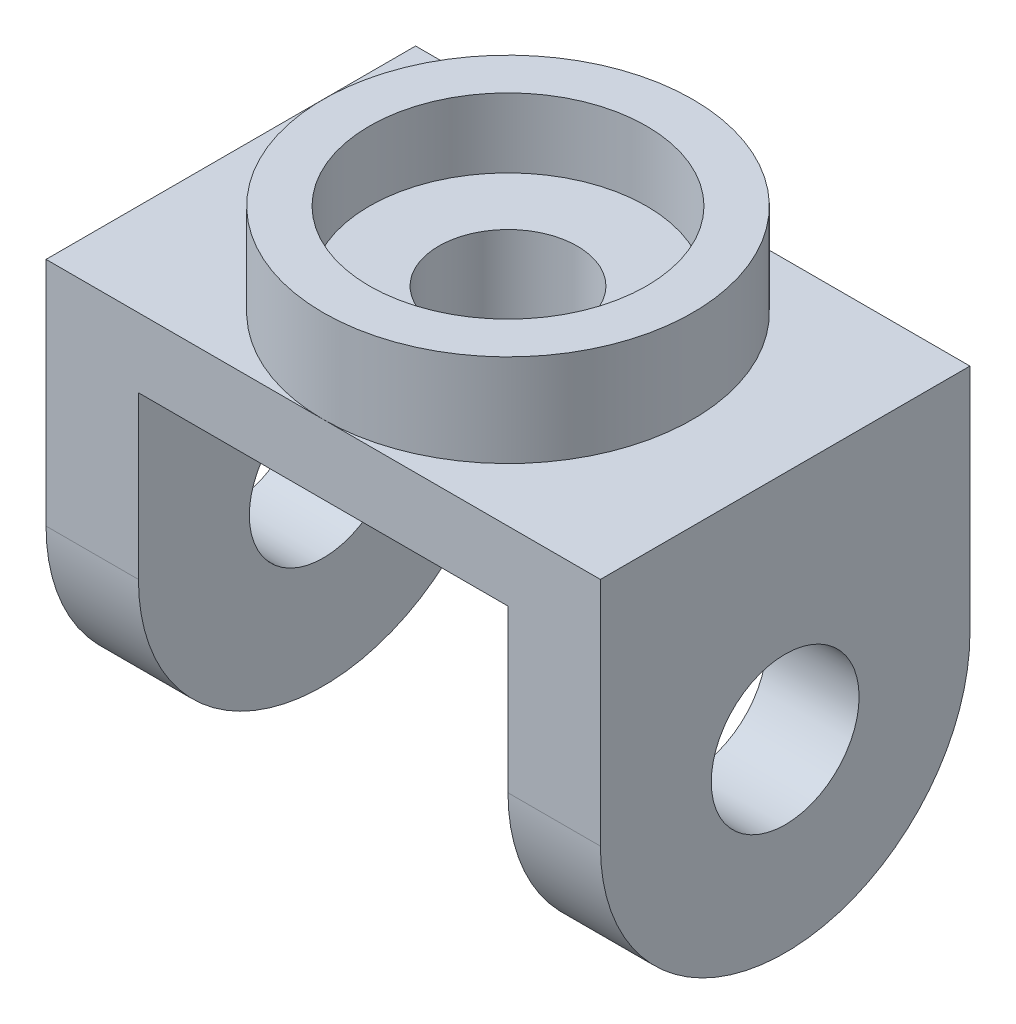
ISO-10303-21;
HEADER;
FILE_DESCRIPTION(('STEP AP214'),'2;1');
FILE_NAME('part.step','',(''),(''),'','','');
FILE_SCHEMA(('AUTOMOTIVE_DESIGN { 1 0 10303 214 1 1 1 1 }'));
ENDSEC;
DATA;
#1=APPLICATION_CONTEXT('core data for automotive mechanical design processes');
#2=APPLICATION_PROTOCOL_DEFINITION('international standard','automotive_design',2000,#1);
#3=PRODUCT_CONTEXT('',#1,'mechanical');
#4=PRODUCT('Part','Part','',(#3));
#5=PRODUCT_RELATED_PRODUCT_CATEGORY('part','',(#4));
#6=PRODUCT_DEFINITION_FORMATION('','',#4);
#7=PRODUCT_DEFINITION_CONTEXT('part definition',#1,'design');
#8=PRODUCT_DEFINITION('design','',#6,#7);
#9=PRODUCT_DEFINITION_SHAPE('','',#8);
#10=(LENGTH_UNIT() NAMED_UNIT(*) SI_UNIT(.MILLI.,.METRE.));
#11=(NAMED_UNIT(*) PLANE_ANGLE_UNIT() SI_UNIT($,.RADIAN.));
#12=(NAMED_UNIT(*) SI_UNIT($,.STERADIAN.) SOLID_ANGLE_UNIT());
#13=UNCERTAINTY_MEASURE_WITH_UNIT(LENGTH_MEASURE(1.E-05),#10,'distance_accuracy_value','');
#14=(GEOMETRIC_REPRESENTATION_CONTEXT(3) GLOBAL_UNCERTAINTY_ASSIGNED_CONTEXT((#13)) GLOBAL_UNIT_ASSIGNED_CONTEXT((#10,
#11,#12)) REPRESENTATION_CONTEXT('',''));
#15=CARTESIAN_POINT('',(0.,0.,0.));
#16=DIRECTION('',(0.,0.,1.));
#17=DIRECTION('',(1.,0.,0.));
#18=AXIS2_PLACEMENT_3D('',#15,#16,#17);
#19=CARTESIAN_POINT('',(0.,0.,0.));
#20=DIRECTION('',(0.,1.,0.));
#21=DIRECTION('',(0.,0.,1.));
#22=AXIS2_PLACEMENT_3D('',#19,#20,#21);
#23=PLANE('',#22);
#24=CARTESIAN_POINT('',(0.,0.,0.));
#25=DIRECTION('',(0.,1.,0.));
#26=DIRECTION('',(0.,0.,1.));
#27=AXIS2_PLACEMENT_3D('',#24,#25,#26);
#28=CIRCLE('',#27,15.);
#29=CARTESIAN_POINT('',(0.,0.,15.));
#30=VERTEX_POINT('',#29);
#31=EDGE_CURVE('E250',#30,#30,#28,.F.);
#32=ORIENTED_EDGE('',*,*,#31,.F.);
#33=EDGE_LOOP('',(#32));
#34=FACE_BOUND('',#33,.T.);
#35=DIRECTION('',(0.,0.,-1.));
#36=VECTOR('',#35,1.);
#37=CARTESIAN_POINT('',(40.,0.,0.));
#38=LINE('',#37,#36);
#39=CARTESIAN_POINT('',(40.,0.,40.));
#40=VERTEX_POINT('',#39);
#41=CARTESIAN_POINT('',(40.,0.,-40.));
#42=VERTEX_POINT('',#41);
#43=EDGE_CURVE('E111',#40,#42,#38,.T.);
#44=ORIENTED_EDGE('',*,*,#43,.F.);
#45=DIRECTION('',(1.,0.,0.));
#46=VECTOR('',#45,1.);
#47=CARTESIAN_POINT('',(-60.,0.,40.));
#48=LINE('',#47,#46);
#49=CARTESIAN_POINT('',(-40.,0.,40.));
#50=VERTEX_POINT('',#49);
#51=EDGE_CURVE('E174',#50,#40,#48,.T.);
#52=ORIENTED_EDGE('',*,*,#51,.F.);
#53=DIRECTION('',(0.,0.,1.));
#54=VECTOR('',#53,1.);
#55=CARTESIAN_POINT('',(-40.,0.,0.));
#56=LINE('',#55,#54);
#57=CARTESIAN_POINT('',(-40.,0.,-40.));
#58=VERTEX_POINT('',#57);
#59=EDGE_CURVE('E11',#58,#50,#56,.T.);
#60=ORIENTED_EDGE('',*,*,#59,.F.);
#61=DIRECTION('',(-1.,0.,0.));
#62=VECTOR('',#61,1.);
#63=CARTESIAN_POINT('',(-60.,0.,-40.));
#64=LINE('',#63,#62);
#65=EDGE_CURVE('E168',#42,#58,#64,.T.);
#66=ORIENTED_EDGE('',*,*,#65,.F.);
#67=EDGE_LOOP('',(#44,#52,#60,#66));
#68=FACE_BOUND('',#67,.T.);
#69=ADVANCED_FACE('F33',(#34,#68),#23,.F.);
#70=CARTESIAN_POINT('',(0.,15.,0.));
#71=DIRECTION('',(0.,1.,0.));
#72=DIRECTION('',(0.,0.,1.));
#73=AXIS2_PLACEMENT_3D('',#70,#71,#72);
#74=PLANE('',#73);
#75=DIRECTION('',(-1.,0.,0.));
#76=VECTOR('',#75,1.);
#77=CARTESIAN_POINT('',(-60.,15.,-40.));
#78=LINE('',#77,#76);
#79=CARTESIAN_POINT('',(60.,15.,-40.));
#80=VERTEX_POINT('',#79);
#81=CARTESIAN_POINT('',(0.,15.,-40.));
#82=VERTEX_POINT('',#81);
#83=EDGE_CURVE('E175',#80,#82,#78,.T.);
#84=ORIENTED_EDGE('',*,*,#83,.T.);
#85=CARTESIAN_POINT('',(0.,15.,0.));
#86=DIRECTION('',(0.,1.,0.));
#87=DIRECTION('',(0.,0.,1.));
#88=AXIS2_PLACEMENT_3D('',#85,#86,#87);
#89=CIRCLE('',#88,40.);
#90=CARTESIAN_POINT('',(0.,15.,40.));
#91=VERTEX_POINT('',#90);
#92=EDGE_CURVE('E47',#91,#82,#89,.T.);
#93=ORIENTED_EDGE('',*,*,#92,.F.);
#94=DIRECTION('',(1.,0.,0.));
#95=VECTOR('',#94,1.);
#96=CARTESIAN_POINT('',(-60.,15.,40.));
#97=LINE('',#96,#95);
#98=CARTESIAN_POINT('',(60.,15.,40.));
#99=VERTEX_POINT('',#98);
#100=EDGE_CURVE('E54',#91,#99,#97,.T.);
#101=ORIENTED_EDGE('',*,*,#100,.T.);
#102=DIRECTION('',(0.,0.,-1.));
#103=VECTOR('',#102,1.);
#104=CARTESIAN_POINT('',(60.,15.,-40.));
#105=LINE('',#104,#103);
#106=EDGE_CURVE('E171',#99,#80,#105,.T.);
#107=ORIENTED_EDGE('',*,*,#106,.T.);
#108=EDGE_LOOP('',(#84,#93,#101,#107));
#109=FACE_BOUND('',#108,.T.);
#110=ADVANCED_FACE('F205',(#109),#74,.T.);
#111=CARTESIAN_POINT('',(60.,15.,-40.));
#112=DIRECTION('',(-1.,0.,0.));
#113=DIRECTION('',(0.,0.,1.));
#114=AXIS2_PLACEMENT_3D('',#111,#112,#113);
#115=PLANE('',#114);
#116=CARTESIAN_POINT('',(60.,-35.,0.));
#117=DIRECTION('',(-1.,0.,0.));
#118=DIRECTION('',(0.,0.,1.));
#119=AXIS2_PLACEMENT_3D('',#116,#117,#118);
#120=CIRCLE('',#119,16.);
#121=CARTESIAN_POINT('',(60.,-35.,16.));
#122=VERTEX_POINT('',#121);
#123=EDGE_CURVE('E134',#122,#122,#120,.T.);
#124=ORIENTED_EDGE('',*,*,#123,.T.);
#125=EDGE_LOOP('',(#124));
#126=FACE_BOUND('',#125,.T.);
#127=DIRECTION('',(0.,-1.,0.));
#128=VECTOR('',#127,1.);
#129=CARTESIAN_POINT('',(60.,15.,40.));
#130=LINE('',#129,#128);
#131=CARTESIAN_POINT('',(60.,-35.,40.));
#132=VERTEX_POINT('',#131);
#133=EDGE_CURVE('E182',#99,#132,#130,.T.);
#134=ORIENTED_EDGE('',*,*,#133,.T.);
#135=CARTESIAN_POINT('',(60.,-35.,0.));
#136=DIRECTION('',(-1.,0.,0.));
#137=DIRECTION('',(0.,0.,1.));
#138=AXIS2_PLACEMENT_3D('',#135,#136,#137);
#139=CIRCLE('',#138,40.);
#140=CARTESIAN_POINT('',(60.,-35.,-40.));
#141=VERTEX_POINT('',#140);
#142=EDGE_CURVE('E114',#141,#132,#139,.T.);
#143=ORIENTED_EDGE('',*,*,#142,.F.);
#144=DIRECTION('',(0.,-1.,0.));
#145=VECTOR('',#144,1.);
#146=CARTESIAN_POINT('',(60.,15.,-40.));
#147=LINE('',#146,#145);
#148=EDGE_CURVE('E120',#80,#141,#147,.T.);
#149=ORIENTED_EDGE('',*,*,#148,.F.);
#150=ORIENTED_EDGE('',*,*,#106,.F.);
#151=EDGE_LOOP('',(#134,#143,#149,#150));
#152=FACE_BOUND('',#151,.T.);
#153=ADVANCED_FACE('F35',(#126,#152),#115,.F.);
#154=CARTESIAN_POINT('',(-60.,15.,-40.));
#155=DIRECTION('',(0.,0.,1.));
#156=DIRECTION('',(1.,0.,0.));
#157=AXIS2_PLACEMENT_3D('',#154,#155,#156);
#158=PLANE('',#157);
#159=ORIENTED_EDGE('',*,*,#148,.T.);
#160=DIRECTION('',(1.,0.,0.));
#161=VECTOR('',#160,1.);
#162=CARTESIAN_POINT('',(40.,-35.,-40.));
#163=LINE('',#162,#161);
#164=CARTESIAN_POINT('',(40.,-35.,-40.));
#165=VERTEX_POINT('',#164);
#166=EDGE_CURVE('E117',#165,#141,#163,.T.);
#167=ORIENTED_EDGE('',*,*,#166,.F.);
#168=DIRECTION('',(0.,-1.,0.));
#169=VECTOR('',#168,1.);
#170=CARTESIAN_POINT('',(40.,15.,-40.));
#171=LINE('',#170,#169);
#172=EDGE_CURVE('E104',#42,#165,#171,.T.);
#173=ORIENTED_EDGE('',*,*,#172,.F.);
#174=ORIENTED_EDGE('',*,*,#65,.T.);
#175=DIRECTION('',(0.,-1.,0.));
#176=VECTOR('',#175,1.);
#177=CARTESIAN_POINT('',(-40.,15.,-40.));
#178=LINE('',#177,#176);
#179=CARTESIAN_POINT('',(-40.,-35.,-40.));
#180=VERTEX_POINT('',#179);
#181=EDGE_CURVE('E149',#58,#180,#178,.T.);
#182=ORIENTED_EDGE('',*,*,#181,.T.);
#183=DIRECTION('',(-1.,0.,0.));
#184=VECTOR('',#183,1.);
#185=CARTESIAN_POINT('',(-40.,-35.,-40.));
#186=LINE('',#185,#184);
#187=CARTESIAN_POINT('',(-60.,-35.,-40.));
#188=VERTEX_POINT('',#187);
#189=EDGE_CURVE('E151',#180,#188,#186,.T.);
#190=ORIENTED_EDGE('',*,*,#189,.T.);
#191=DIRECTION('',(0.,-1.,0.));
#192=VECTOR('',#191,1.);
#193=CARTESIAN_POINT('',(-60.,15.,-40.));
#194=LINE('',#193,#192);
#195=CARTESIAN_POINT('',(-60.,15.,-40.));
#196=VERTEX_POINT('',#195);
#197=EDGE_CURVE('E189',#196,#188,#194,.T.);
#198=ORIENTED_EDGE('',*,*,#197,.F.);
#199=EDGE_CURVE('E173',#82,#196,#78,.T.);
#200=ORIENTED_EDGE('',*,*,#199,.F.);
#201=ORIENTED_EDGE('',*,*,#83,.F.);
#202=EDGE_LOOP('',(#159,#167,#173,#174,#182,#190,#198,#200,#201));
#203=FACE_BOUND('',#202,.T.);
#204=ADVANCED_FACE('F118',(#203),#158,.F.);
#205=CARTESIAN_POINT('',(-60.,15.,-40.));
#206=DIRECTION('',(1.,0.,0.));
#207=DIRECTION('',(0.,0.,-1.));
#208=AXIS2_PLACEMENT_3D('',#205,#206,#207);
#209=PLANE('',#208);
#210=ORIENTED_EDGE('',*,*,#197,.T.);
#211=CARTESIAN_POINT('',(-60.,-35.,0.));
#212=DIRECTION('',(-1.,0.,0.));
#213=DIRECTION('',(0.,0.,1.));
#214=AXIS2_PLACEMENT_3D('',#211,#212,#213);
#215=CIRCLE('',#214,40.);
#216=CARTESIAN_POINT('',(-60.,-35.,40.));
#217=VERTEX_POINT('',#216);
#218=EDGE_CURVE('E143',#188,#217,#215,.T.);
#219=ORIENTED_EDGE('',*,*,#218,.T.);
#220=DIRECTION('',(0.,-1.,0.));
#221=VECTOR('',#220,1.);
#222=CARTESIAN_POINT('',(-60.,15.,40.));
#223=LINE('',#222,#221);
#224=CARTESIAN_POINT('',(-60.,15.,40.));
#225=VERTEX_POINT('',#224);
#226=EDGE_CURVE('E187',#225,#217,#223,.T.);
#227=ORIENTED_EDGE('',*,*,#226,.F.);
#228=DIRECTION('',(0.,0.,1.));
#229=VECTOR('',#228,1.);
#230=CARTESIAN_POINT('',(-60.,15.,-40.));
#231=LINE('',#230,#229);
#232=EDGE_CURVE('E177',#196,#225,#231,.T.);
#233=ORIENTED_EDGE('',*,*,#232,.F.);
#234=EDGE_LOOP('',(#210,#219,#227,#233));
#235=FACE_BOUND('',#234,.T.);
#236=CARTESIAN_POINT('',(-60.,-35.,0.));
#237=DIRECTION('',(-1.,0.,0.));
#238=DIRECTION('',(0.,0.,1.));
#239=AXIS2_PLACEMENT_3D('',#236,#237,#238);
#240=CIRCLE('',#239,16.);
#241=CARTESIAN_POINT('',(-60.,-35.,16.));
#242=VERTEX_POINT('',#241);
#243=EDGE_CURVE('E137',#242,#242,#240,.T.);
#244=ORIENTED_EDGE('',*,*,#243,.F.);
#245=EDGE_LOOP('',(#244));
#246=FACE_BOUND('',#245,.T.);
#247=ADVANCED_FACE('F210',(#235,#246),#209,.F.);
#248=CARTESIAN_POINT('',(-60.,15.,40.));
#249=DIRECTION('',(0.,0.,-1.));
#250=DIRECTION('',(-1.,0.,0.));
#251=AXIS2_PLACEMENT_3D('',#248,#249,#250);
#252=PLANE('',#251);
#253=ORIENTED_EDGE('',*,*,#133,.F.);
#254=ORIENTED_EDGE('',*,*,#100,.F.);
#255=EDGE_CURVE('E179',#225,#91,#97,.T.);
#256=ORIENTED_EDGE('',*,*,#255,.F.);
#257=ORIENTED_EDGE('',*,*,#226,.T.);
#258=DIRECTION('',(-1.,0.,0.));
#259=VECTOR('',#258,1.);
#260=CARTESIAN_POINT('',(-40.,-35.,40.));
#261=LINE('',#260,#259);
#262=CARTESIAN_POINT('',(-40.,-35.,40.));
#263=VERTEX_POINT('',#262);
#264=EDGE_CURVE('E156',#263,#217,#261,.T.);
#265=ORIENTED_EDGE('',*,*,#264,.F.);
#266=DIRECTION('',(0.,-1.,0.));
#267=VECTOR('',#266,1.);
#268=CARTESIAN_POINT('',(-40.,15.,40.));
#269=LINE('',#268,#267);
#270=EDGE_CURVE('E144',#50,#263,#269,.T.);
#271=ORIENTED_EDGE('',*,*,#270,.F.);
#272=ORIENTED_EDGE('',*,*,#51,.T.);
#273=DIRECTION('',(0.,-1.,0.));
#274=VECTOR('',#273,1.);
#275=CARTESIAN_POINT('',(40.,15.,40.));
#276=LINE('',#275,#274);
#277=CARTESIAN_POINT('',(40.,-35.,40.));
#278=VERTEX_POINT('',#277);
#279=EDGE_CURVE('E128',#40,#278,#276,.T.);
#280=ORIENTED_EDGE('',*,*,#279,.T.);
#281=DIRECTION('',(1.,0.,0.));
#282=VECTOR('',#281,1.);
#283=CARTESIAN_POINT('',(40.,-35.,40.));
#284=LINE('',#283,#282);
#285=EDGE_CURVE('E124',#278,#132,#284,.T.);
#286=ORIENTED_EDGE('',*,*,#285,.T.);
#287=EDGE_LOOP('',(#253,#254,#256,#257,#265,#271,#272,#280,#286));
#288=FACE_BOUND('',#287,.T.);
#289=ADVANCED_FACE('F203',(#288),#252,.F.);
#290=ORIENTED_EDGE('',*,*,#255,.T.);
#291=EDGE_CURVE('E170',#82,#91,#89,.T.);
#292=ORIENTED_EDGE('',*,*,#291,.F.);
#293=ORIENTED_EDGE('',*,*,#199,.T.);
#294=ORIENTED_EDGE('',*,*,#232,.T.);
#295=EDGE_LOOP('',(#290,#292,#293,#294));
#296=FACE_BOUND('',#295,.T.);
#297=ADVANCED_FACE('F199',(#296),#74,.T.);
#298=CARTESIAN_POINT('',(0.,35.,0.));
#299=DIRECTION('',(0.,1.,0.));
#300=DIRECTION('',(0.,0.,1.));
#301=AXIS2_PLACEMENT_3D('',#298,#299,#300);
#302=PLANE('',#301);
#303=CARTESIAN_POINT('',(0.,35.,0.));
#304=DIRECTION('',(0.,1.,0.));
#305=DIRECTION('',(0.,0.,1.));
#306=AXIS2_PLACEMENT_3D('',#303,#304,#305);
#307=CIRCLE('',#306,40.);
#308=CARTESIAN_POINT('',(0.,35.,40.));
#309=VERTEX_POINT('',#308);
#310=EDGE_CURVE('E165',#309,#309,#307,.T.);
#311=ORIENTED_EDGE('',*,*,#310,.T.);
#312=EDGE_LOOP('',(#311));
#313=FACE_BOUND('',#312,.T.);
#314=CARTESIAN_POINT('',(0.,35.,0.));
#315=DIRECTION('',(0.,1.,0.));
#316=DIRECTION('',(0.,0.,1.));
#317=AXIS2_PLACEMENT_3D('',#314,#315,#316);
#318=CIRCLE('',#317,30.);
#319=CARTESIAN_POINT('',(0.,35.,30.));
#320=VERTEX_POINT('',#319);
#321=EDGE_CURVE('E162',#320,#320,#318,.T.);
#322=ORIENTED_EDGE('',*,*,#321,.F.);
#323=EDGE_LOOP('',(#322));
#324=FACE_BOUND('',#323,.T.);
#325=ADVANCED_FACE('F273',(#313,#324),#302,.T.);
#326=CARTESIAN_POINT('',(0.,35.,0.));
#327=DIRECTION('',(0.,-1.,0.));
#328=DIRECTION('',(0.,0.,-1.));
#329=AXIS2_PLACEMENT_3D('',#326,#327,#328);
#330=CYLINDRICAL_SURFACE('',#329,40.);
#331=ORIENTED_EDGE('',*,*,#310,.F.);
#332=EDGE_LOOP('',(#331));
#333=FACE_BOUND('',#332,.T.);
#334=ORIENTED_EDGE('',*,*,#92,.T.);
#335=ORIENTED_EDGE('',*,*,#291,.T.);
#336=EDGE_LOOP('',(#334,#335));
#337=FACE_BOUND('',#336,.T.);
#338=ADVANCED_FACE('F195',(#333,#337),#330,.T.);
#339=CARTESIAN_POINT('',(0.,35.,0.));
#340=DIRECTION('',(0.,-1.,0.));
#341=DIRECTION('',(0.,0.,-1.));
#342=AXIS2_PLACEMENT_3D('',#339,#340,#341);
#343=CYLINDRICAL_SURFACE('',#342,30.);
#344=CARTESIAN_POINT('',(0.,20.,0.));
#345=DIRECTION('',(0.,1.,0.));
#346=DIRECTION('',(0.,0.,1.));
#347=AXIS2_PLACEMENT_3D('',#344,#345,#346);
#348=CIRCLE('',#347,30.);
#349=CARTESIAN_POINT('',(0.,20.,30.));
#350=VERTEX_POINT('',#349);
#351=EDGE_CURVE('E41',#350,#350,#348,.T.);
#352=ORIENTED_EDGE('',*,*,#351,.F.);
#353=EDGE_LOOP('',(#352));
#354=FACE_BOUND('',#353,.T.);
#355=ORIENTED_EDGE('',*,*,#321,.T.);
#356=EDGE_LOOP('',(#355));
#357=FACE_BOUND('',#356,.T.);
#358=ADVANCED_FACE('F265',(#354,#357),#343,.F.);
#359=CARTESIAN_POINT('',(0.,20.,0.));
#360=DIRECTION('',(0.,1.,0.));
#361=DIRECTION('',(0.,0.,1.));
#362=AXIS2_PLACEMENT_3D('',#359,#360,#361);
#363=PLANE('',#362);
#364=CARTESIAN_POINT('',(0.,20.,0.));
#365=DIRECTION('',(0.,1.,0.));
#366=DIRECTION('',(0.,0.,1.));
#367=AXIS2_PLACEMENT_3D('',#364,#365,#366);
#368=CIRCLE('',#367,15.);
#369=CARTESIAN_POINT('',(0.,20.,15.));
#370=VERTEX_POINT('',#369);
#371=EDGE_CURVE('E159',#370,#370,#368,.T.);
#372=ORIENTED_EDGE('',*,*,#371,.F.);
#373=EDGE_LOOP('',(#372));
#374=FACE_BOUND('',#373,.T.);
#375=ORIENTED_EDGE('',*,*,#351,.T.);
#376=EDGE_LOOP('',(#375));
#377=FACE_BOUND('',#376,.T.);
#378=ADVANCED_FACE('F256',(#374,#377),#363,.T.);
#379=CARTESIAN_POINT('',(0.,0.,0.));
#380=DIRECTION('',(0.,1.,0.));
#381=DIRECTION('',(0.,0.,1.));
#382=AXIS2_PLACEMENT_3D('',#379,#380,#381);
#383=CYLINDRICAL_SURFACE('',#382,15.);
#384=ORIENTED_EDGE('',*,*,#371,.T.);
#385=EDGE_LOOP('',(#384));
#386=FACE_BOUND('',#385,.T.);
#387=ORIENTED_EDGE('',*,*,#31,.T.);
#388=EDGE_LOOP('',(#387));
#389=FACE_BOUND('',#388,.T.);
#390=ADVANCED_FACE('F254',(#386,#389),#383,.F.);
#391=CARTESIAN_POINT('',(-40.,-35.,0.));
#392=DIRECTION('',(-1.,0.,0.));
#393=DIRECTION('',(0.,0.,1.));
#394=AXIS2_PLACEMENT_3D('',#391,#392,#393);
#395=PLANE('',#394);
#396=CARTESIAN_POINT('',(-40.,-35.,0.));
#397=DIRECTION('',(-1.,0.,0.));
#398=DIRECTION('',(0.,0.,1.));
#399=AXIS2_PLACEMENT_3D('',#396,#397,#398);
#400=CIRCLE('',#399,16.);
#401=CARTESIAN_POINT('',(-40.,-35.,16.));
#402=VERTEX_POINT('',#401);
#403=EDGE_CURVE('E140',#402,#402,#400,.F.);
#404=ORIENTED_EDGE('',*,*,#403,.F.);
#405=EDGE_LOOP('',(#404));
#406=FACE_BOUND('',#405,.T.);
#407=ORIENTED_EDGE('',*,*,#181,.F.);
#408=ORIENTED_EDGE('',*,*,#59,.T.);
#409=ORIENTED_EDGE('',*,*,#270,.T.);
#410=CARTESIAN_POINT('',(-40.,-35.,0.));
#411=DIRECTION('',(-1.,0.,0.));
#412=DIRECTION('',(0.,0.,1.));
#413=AXIS2_PLACEMENT_3D('',#410,#411,#412);
#414=CIRCLE('',#413,40.);
#415=EDGE_CURVE('E146',#180,#263,#414,.T.);
#416=ORIENTED_EDGE('',*,*,#415,.F.);
#417=EDGE_LOOP('',(#407,#408,#409,#416));
#418=FACE_BOUND('',#417,.T.);
#419=ADVANCED_FACE('F219',(#406,#418),#395,.F.);
#420=CARTESIAN_POINT('',(-40.,-35.,0.));
#421=DIRECTION('',(-1.,0.,0.));
#422=DIRECTION('',(0.,0.,1.));
#423=AXIS2_PLACEMENT_3D('',#420,#421,#422);
#424=CYLINDRICAL_SURFACE('',#423,40.);
#425=ORIENTED_EDGE('',*,*,#218,.F.);
#426=ORIENTED_EDGE('',*,*,#189,.F.);
#427=ORIENTED_EDGE('',*,*,#415,.T.);
#428=ORIENTED_EDGE('',*,*,#264,.T.);
#429=EDGE_LOOP('',(#425,#426,#427,#428));
#430=FACE_BOUND('',#429,.T.);
#431=ADVANCED_FACE('F215',(#430),#424,.T.);
#432=CARTESIAN_POINT('',(60.001,-35.,0.));
#433=DIRECTION('',(-1.,0.,0.));
#434=DIRECTION('',(0.,0.,1.));
#435=AXIS2_PLACEMENT_3D('',#432,#433,#434);
#436=CYLINDRICAL_SURFACE('',#435,16.);
#437=ORIENTED_EDGE('',*,*,#243,.T.);
#438=EDGE_LOOP('',(#437));
#439=FACE_BOUND('',#438,.T.);
#440=ORIENTED_EDGE('',*,*,#403,.T.);
#441=EDGE_LOOP('',(#440));
#442=FACE_BOUND('',#441,.T.);
#443=ADVANCED_FACE('F315',(#439,#442),#436,.F.);
#444=CARTESIAN_POINT('',(40.,-35.,0.));
#445=DIRECTION('',(1.,0.,0.));
#446=DIRECTION('',(0.,0.,1.));
#447=AXIS2_PLACEMENT_3D('',#444,#445,#446);
#448=PLANE('',#447);
#449=CARTESIAN_POINT('',(40.,-35.,0.));
#450=DIRECTION('',(1.,0.,0.));
#451=DIRECTION('',(0.,0.,-1.));
#452=AXIS2_PLACEMENT_3D('',#449,#450,#451);
#453=CIRCLE('',#452,16.);
#454=CARTESIAN_POINT('',(40.,-35.,-16.));
#455=VERTEX_POINT('',#454);
#456=EDGE_CURVE('E247',#455,#455,#453,.T.);
#457=ORIENTED_EDGE('',*,*,#456,.T.);
#458=EDGE_LOOP('',(#457));
#459=FACE_BOUND('',#458,.T.);
#460=ORIENTED_EDGE('',*,*,#279,.F.);
#461=ORIENTED_EDGE('',*,*,#43,.T.);
#462=ORIENTED_EDGE('',*,*,#172,.T.);
#463=CARTESIAN_POINT('',(40.,-35.,0.));
#464=DIRECTION('',(-1.,0.,0.));
#465=DIRECTION('',(0.,0.,1.));
#466=AXIS2_PLACEMENT_3D('',#463,#464,#465);
#467=CIRCLE('',#466,40.);
#468=EDGE_CURVE('E108',#165,#278,#467,.T.);
#469=ORIENTED_EDGE('',*,*,#468,.T.);
#470=EDGE_LOOP('',(#460,#461,#462,#469));
#471=FACE_BOUND('',#470,.T.);
#472=ADVANCED_FACE('F106',(#459,#471),#448,.F.);
#473=CARTESIAN_POINT('',(40.,-35.,0.));
#474=DIRECTION('',(1.,0.,0.));
#475=DIRECTION('',(0.,0.,-1.));
#476=AXIS2_PLACEMENT_3D('',#473,#474,#475);
#477=CYLINDRICAL_SURFACE('',#476,40.);
#478=ORIENTED_EDGE('',*,*,#142,.T.);
#479=ORIENTED_EDGE('',*,*,#285,.F.);
#480=ORIENTED_EDGE('',*,*,#468,.F.);
#481=ORIENTED_EDGE('',*,*,#166,.T.);
#482=EDGE_LOOP('',(#478,#479,#480,#481));
#483=FACE_BOUND('',#482,.T.);
#484=ADVANCED_FACE('F126',(#483),#477,.T.);
#485=CARTESIAN_POINT('',(-60.001,-35.,0.));
#486=DIRECTION('',(1.,0.,0.));
#487=DIRECTION('',(0.,0.,-1.));
#488=AXIS2_PLACEMENT_3D('',#485,#486,#487);
#489=CYLINDRICAL_SURFACE('',#488,16.);
#490=ORIENTED_EDGE('',*,*,#123,.F.);
#491=EDGE_LOOP('',(#490));
#492=FACE_BOUND('',#491,.T.);
#493=ORIENTED_EDGE('',*,*,#456,.F.);
#494=EDGE_LOOP('',(#493));
#495=FACE_BOUND('',#494,.T.);
#496=ADVANCED_FACE('F379',(#492,#495),#489,.F.);
#497=CLOSED_SHELL('',(#69,#110,#153,#204,#247,#289,#297,#325,#338,#358,#378,#390,#419,#431,#443,
#472,#484,#496));
#498=MANIFOLD_SOLID_BREP('B2',#497);
#499=ADVANCED_BREP_SHAPE_REPRESENTATION('',(#18,#498),#14);
#500=SHAPE_DEFINITION_REPRESENTATION(#9,#499);
ENDSEC;
END-ISO-10303-21;
